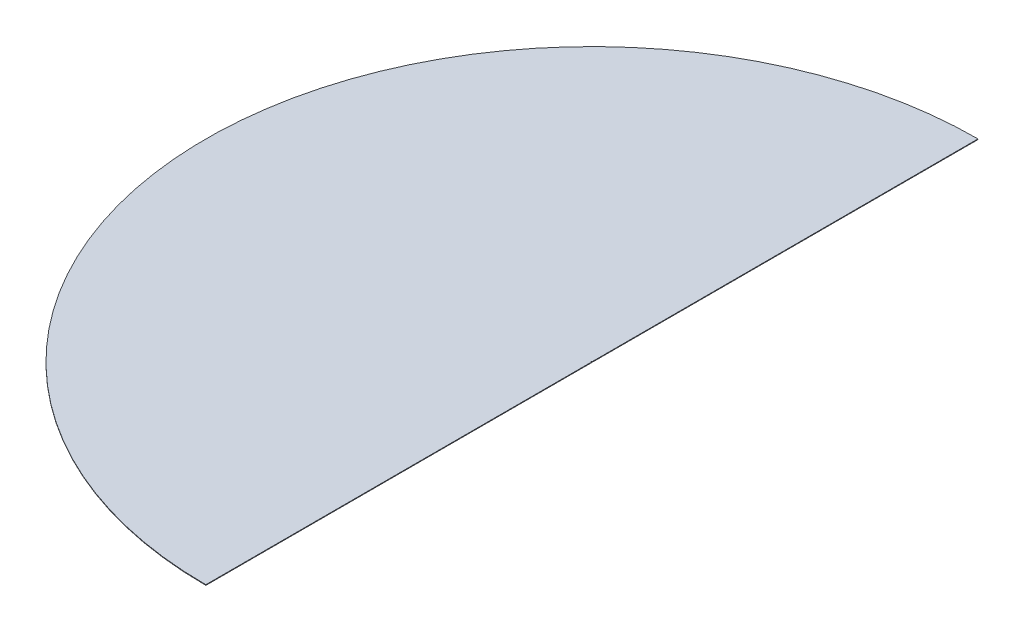
ISO-10303-21;
HEADER;
FILE_DESCRIPTION(('STEP AP214'),'2;1');
FILE_NAME('part.step','',(''),(''),'','','');
FILE_SCHEMA(('AUTOMOTIVE_DESIGN { 1 0 10303 214 1 1 1 1 }'));
ENDSEC;
DATA;
#1=APPLICATION_CONTEXT('core data for automotive mechanical design processes');
#2=APPLICATION_PROTOCOL_DEFINITION('international standard','automotive_design',2000,#1);
#3=PRODUCT_CONTEXT('',#1,'mechanical');
#4=PRODUCT('Part','Part','',(#3));
#5=PRODUCT_RELATED_PRODUCT_CATEGORY('part','',(#4));
#6=PRODUCT_DEFINITION_FORMATION('','',#4);
#7=PRODUCT_DEFINITION_CONTEXT('part definition',#1,'design');
#8=PRODUCT_DEFINITION('design','',#6,#7);
#9=PRODUCT_DEFINITION_SHAPE('','',#8);
#10=(LENGTH_UNIT() NAMED_UNIT(*) SI_UNIT(.MILLI.,.METRE.));
#11=(NAMED_UNIT(*) PLANE_ANGLE_UNIT() SI_UNIT($,.RADIAN.));
#12=(NAMED_UNIT(*) SI_UNIT($,.STERADIAN.) SOLID_ANGLE_UNIT());
#13=UNCERTAINTY_MEASURE_WITH_UNIT(LENGTH_MEASURE(1.E-05),#10,'distance_accuracy_value','');
#14=(GEOMETRIC_REPRESENTATION_CONTEXT(3) GLOBAL_UNCERTAINTY_ASSIGNED_CONTEXT((#13)) GLOBAL_UNIT_ASSIGNED_CONTEXT((#10,
#11,#12)) REPRESENTATION_CONTEXT('',''));
#15=CARTESIAN_POINT('',(0.,0.,0.));
#16=DIRECTION('',(0.,0.,1.));
#17=DIRECTION('',(1.,0.,0.));
#18=AXIS2_PLACEMENT_3D('',#15,#16,#17);
#19=CARTESIAN_POINT('',(0.,31.5,0.));
#20=DIRECTION('',(0.,-1.,0.));
#21=DIRECTION('',(0.,0.,-1.));
#22=AXIS2_PLACEMENT_3D('',#19,#20,#21);
#23=CYLINDRICAL_SURFACE('',#22,20000.);
#24=CARTESIAN_POINT('',(0.,0.,0.));
#25=DIRECTION('',(0.,1.,0.));
#26=DIRECTION('',(0.,0.,1.));
#27=AXIS2_PLACEMENT_3D('',#24,#25,#26);
#28=CIRCLE('',#27,20000.);
#29=CARTESIAN_POINT('',(0.,0.,-20000.));
#30=VERTEX_POINT('',#29);
#31=CARTESIAN_POINT('',(0.,0.,20000.));
#32=VERTEX_POINT('',#31);
#33=EDGE_CURVE('E96',#30,#32,#28,.T.);
#34=ORIENTED_EDGE('',*,*,#33,.T.);
#35=DIRECTION('',(0.,-1.,0.));
#36=VECTOR('',#35,1.);
#37=CARTESIAN_POINT('',(0.,31.5,20000.));
#38=LINE('',#37,#36);
#39=CARTESIAN_POINT('',(0.,31.5,20000.));
#40=VERTEX_POINT('',#39);
#41=EDGE_CURVE('E11',#40,#32,#38,.T.);
#42=ORIENTED_EDGE('',*,*,#41,.F.);
#43=CARTESIAN_POINT('',(0.,31.5,0.));
#44=DIRECTION('',(0.,1.,0.));
#45=DIRECTION('',(0.,0.,1.));
#46=AXIS2_PLACEMENT_3D('',#43,#44,#45);
#47=CIRCLE('',#46,20000.);
#48=CARTESIAN_POINT('',(0.,31.5,-20000.));
#49=VERTEX_POINT('',#48);
#50=EDGE_CURVE('E84',#49,#40,#47,.T.);
#51=ORIENTED_EDGE('',*,*,#50,.F.);
#52=DIRECTION('',(0.,-1.,0.));
#53=VECTOR('',#52,1.);
#54=CARTESIAN_POINT('',(0.,31.5,-20000.));
#55=LINE('',#54,#53);
#56=EDGE_CURVE('E92',#49,#30,#55,.T.);
#57=ORIENTED_EDGE('',*,*,#56,.T.);
#58=EDGE_LOOP('',(#34,#42,#51,#57));
#59=FACE_BOUND('',#58,.T.);
#60=ADVANCED_FACE('F33',(#59),#23,.T.);
#61=CARTESIAN_POINT('',(0.,31.5,28.5));
#62=DIRECTION('',(-1.,0.,0.));
#63=DIRECTION('',(0.,0.,1.));
#64=AXIS2_PLACEMENT_3D('',#61,#62,#63);
#65=PLANE('',#64);
#66=DIRECTION('',(0.,0.,-1.));
#67=VECTOR('',#66,1.);
#68=CARTESIAN_POINT('',(0.,0.,28.5));
#69=LINE('',#68,#67);
#70=CARTESIAN_POINT('',(0.,0.,28.5));
#71=VERTEX_POINT('',#70);
#72=EDGE_CURVE('E88',#32,#71,#69,.T.);
#73=ORIENTED_EDGE('',*,*,#72,.T.);
#74=DIRECTION('',(0.,-1.,0.));
#75=VECTOR('',#74,1.);
#76=CARTESIAN_POINT('',(0.,31.5,28.5));
#77=LINE('',#76,#75);
#78=CARTESIAN_POINT('',(0.,31.5,28.5));
#79=VERTEX_POINT('',#78);
#80=EDGE_CURVE('E41',#79,#71,#77,.T.);
#81=ORIENTED_EDGE('',*,*,#80,.F.);
#82=DIRECTION('',(0.,0.,-1.));
#83=VECTOR('',#82,1.);
#84=CARTESIAN_POINT('',(0.,31.5,28.5));
#85=LINE('',#84,#83);
#86=EDGE_CURVE('E79',#40,#79,#85,.T.);
#87=ORIENTED_EDGE('',*,*,#86,.F.);
#88=ORIENTED_EDGE('',*,*,#41,.T.);
#89=EDGE_LOOP('',(#73,#81,#87,#88));
#90=FACE_BOUND('',#89,.T.);
#91=ADVANCED_FACE('F87',(#90),#65,.F.);
#92=CARTESIAN_POINT('',(0.,31.5,0.));
#93=DIRECTION('',(0.,-1.,0.));
#94=DIRECTION('',(0.,0.,-1.));
#95=AXIS2_PLACEMENT_3D('',#92,#93,#94);
#96=CYLINDRICAL_SURFACE('',#95,28.5);
#97=CARTESIAN_POINT('',(0.,0.,0.));
#98=DIRECTION('',(0.,-1.,0.));
#99=DIRECTION('',(0.,0.,1.));
#100=AXIS2_PLACEMENT_3D('',#97,#98,#99);
#101=CIRCLE('',#100,28.5);
#102=CARTESIAN_POINT('',(0.,0.,-28.5));
#103=VERTEX_POINT('',#102);
#104=EDGE_CURVE('E66',#71,#103,#101,.T.);
#105=ORIENTED_EDGE('',*,*,#104,.T.);
#106=DIRECTION('',(0.,-1.,0.));
#107=VECTOR('',#106,1.);
#108=CARTESIAN_POINT('',(0.,31.5,-28.5));
#109=LINE('',#108,#107);
#110=CARTESIAN_POINT('',(0.,31.5,-28.5));
#111=VERTEX_POINT('',#110);
#112=EDGE_CURVE('E89',#111,#103,#109,.T.);
#113=ORIENTED_EDGE('',*,*,#112,.F.);
#114=CARTESIAN_POINT('',(0.,31.5,0.));
#115=DIRECTION('',(0.,-1.,0.));
#116=DIRECTION('',(0.,0.,1.));
#117=AXIS2_PLACEMENT_3D('',#114,#115,#116);
#118=CIRCLE('',#117,28.5);
#119=EDGE_CURVE('E82',#79,#111,#118,.T.);
#120=ORIENTED_EDGE('',*,*,#119,.F.);
#121=ORIENTED_EDGE('',*,*,#80,.T.);
#122=EDGE_LOOP('',(#105,#113,#120,#121));
#123=FACE_BOUND('',#122,.T.);
#124=ADVANCED_FACE('F90',(#123),#96,.F.);
#125=CARTESIAN_POINT('',(0.,31.5,-20000.));
#126=DIRECTION('',(-1.,0.,0.));
#127=DIRECTION('',(0.,0.,1.));
#128=AXIS2_PLACEMENT_3D('',#125,#126,#127);
#129=PLANE('',#128);
#130=DIRECTION('',(0.,0.,-1.));
#131=VECTOR('',#130,1.);
#132=CARTESIAN_POINT('',(0.,0.,-20000.));
#133=LINE('',#132,#131);
#134=EDGE_CURVE('E72',#103,#30,#133,.T.);
#135=ORIENTED_EDGE('',*,*,#134,.T.);
#136=ORIENTED_EDGE('',*,*,#56,.F.);
#137=DIRECTION('',(0.,0.,-1.));
#138=VECTOR('',#137,1.);
#139=CARTESIAN_POINT('',(0.,31.5,-20000.));
#140=LINE('',#139,#138);
#141=EDGE_CURVE('E49',#111,#49,#140,.T.);
#142=ORIENTED_EDGE('',*,*,#141,.F.);
#143=ORIENTED_EDGE('',*,*,#112,.T.);
#144=EDGE_LOOP('',(#135,#136,#142,#143));
#145=FACE_BOUND('',#144,.T.);
#146=ADVANCED_FACE('F103',(#145),#129,.F.);
#147=CARTESIAN_POINT('',(0.,31.5,0.));
#148=DIRECTION('',(0.,1.,0.));
#149=DIRECTION('',(0.,0.,1.));
#150=AXIS2_PLACEMENT_3D('',#147,#148,#149);
#151=PLANE('',#150);
#152=ORIENTED_EDGE('',*,*,#50,.T.);
#153=ORIENTED_EDGE('',*,*,#86,.T.);
#154=ORIENTED_EDGE('',*,*,#119,.T.);
#155=ORIENTED_EDGE('',*,*,#141,.T.);
#156=EDGE_LOOP('',(#152,#153,#154,#155));
#157=FACE_BOUND('',#156,.T.);
#158=ADVANCED_FACE('F80',(#157),#151,.T.);
#159=CARTESIAN_POINT('',(0.,0.,0.));
#160=DIRECTION('',(0.,1.,0.));
#161=DIRECTION('',(0.,0.,1.));
#162=AXIS2_PLACEMENT_3D('',#159,#160,#161);
#163=PLANE('',#162);
#164=ORIENTED_EDGE('',*,*,#33,.F.);
#165=ORIENTED_EDGE('',*,*,#134,.F.);
#166=ORIENTED_EDGE('',*,*,#104,.F.);
#167=ORIENTED_EDGE('',*,*,#72,.F.);
#168=EDGE_LOOP('',(#164,#165,#166,#167));
#169=FACE_BOUND('',#168,.T.);
#170=ADVANCED_FACE('F106',(#169),#163,.F.);
#171=CLOSED_SHELL('',(#60,#91,#124,#146,#158,#170));
#172=MANIFOLD_SOLID_BREP('B2',#171);
#173=ADVANCED_BREP_SHAPE_REPRESENTATION('',(#18,#172),#14);
#174=SHAPE_DEFINITION_REPRESENTATION(#9,#173);
ENDSEC;
END-ISO-10303-21;
